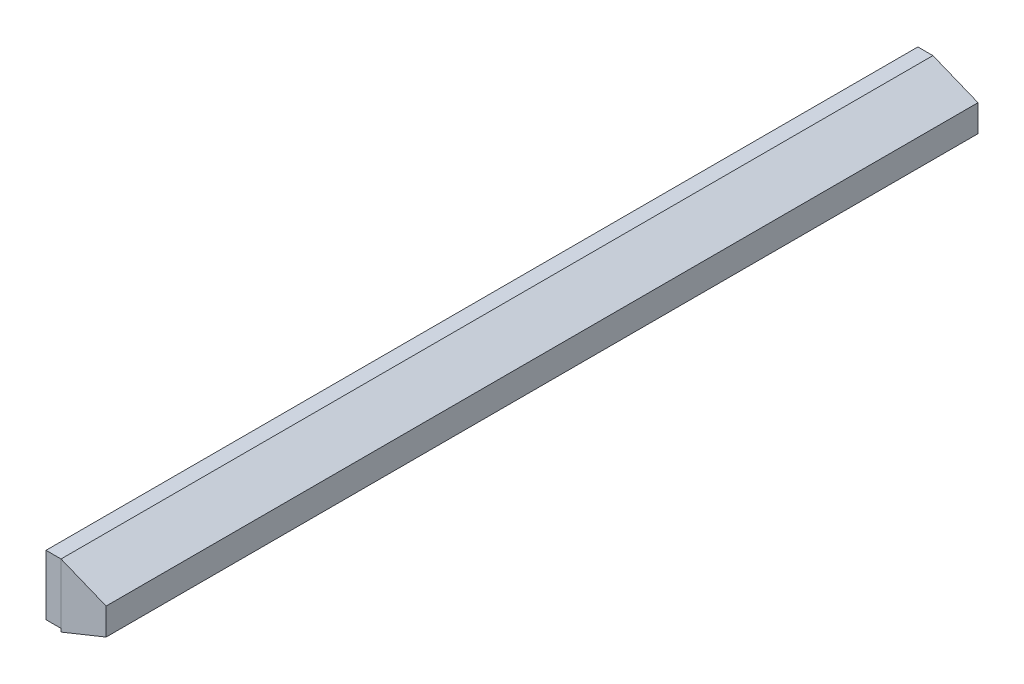
ISO-10303-21;
HEADER;
FILE_DESCRIPTION(('STEP AP214'),'2;1');
FILE_NAME('part.step','',(''),(''),'','','');
FILE_SCHEMA(('AUTOMOTIVE_DESIGN { 1 0 10303 214 1 1 1 1 }'));
ENDSEC;
DATA;
#1=APPLICATION_CONTEXT('core data for automotive mechanical design processes');
#2=APPLICATION_PROTOCOL_DEFINITION('international standard','automotive_design',2000,#1);
#3=PRODUCT_CONTEXT('',#1,'mechanical');
#4=PRODUCT('Part','Part','',(#3));
#5=PRODUCT_RELATED_PRODUCT_CATEGORY('part','',(#4));
#6=PRODUCT_DEFINITION_FORMATION('','',#4);
#7=PRODUCT_DEFINITION_CONTEXT('part definition',#1,'design');
#8=PRODUCT_DEFINITION('design','',#6,#7);
#9=PRODUCT_DEFINITION_SHAPE('','',#8);
#10=(LENGTH_UNIT() NAMED_UNIT(*) SI_UNIT(.MILLI.,.METRE.));
#11=(NAMED_UNIT(*) PLANE_ANGLE_UNIT() SI_UNIT($,.RADIAN.));
#12=(NAMED_UNIT(*) SI_UNIT($,.STERADIAN.) SOLID_ANGLE_UNIT());
#13=UNCERTAINTY_MEASURE_WITH_UNIT(LENGTH_MEASURE(1.E-05),#10,'distance_accuracy_value','');
#14=(GEOMETRIC_REPRESENTATION_CONTEXT(3) GLOBAL_UNCERTAINTY_ASSIGNED_CONTEXT((#13)) GLOBAL_UNIT_ASSIGNED_CONTEXT((#10,
#11,#12)) REPRESENTATION_CONTEXT('',''));
#15=CARTESIAN_POINT('',(0.,0.,0.));
#16=DIRECTION('',(0.,0.,1.));
#17=DIRECTION('',(1.,0.,0.));
#18=AXIS2_PLACEMENT_3D('',#15,#16,#17);
#19=CARTESIAN_POINT('',(2.50000000000001,-8.03019669376367,-145.));
#20=DIRECTION('',(1.,0.,0.));
#21=DIRECTION('',(0.,0.,-1.));
#22=AXIS2_PLACEMENT_3D('',#19,#20,#21);
#23=PLANE('',#22);
#24=DIRECTION('',(0.,1.,0.));
#25=VECTOR('',#24,1.);
#26=CARTESIAN_POINT('',(2.50000000000001,-8.03019669376367,145.));
#27=LINE('',#26,#25);
#28=CARTESIAN_POINT('',(2.50000000000001,-11.0603933875273,145.));
#29=VERTEX_POINT('',#28);
#30=CARTESIAN_POINT('',(2.50000000000001,10.,145.));
#31=VERTEX_POINT('',#30);
#32=EDGE_CURVE('E105',#29,#31,#27,.T.);
#33=ORIENTED_EDGE('',*,*,#32,.T.);
#34=DIRECTION('',(0.,0.,-1.));
#35=VECTOR('',#34,1.);
#36=CARTESIAN_POINT('',(2.50000000000001,10.,0.));
#37=LINE('',#36,#35);
#38=CARTESIAN_POINT('',(2.50000000000001,10.,-145.));
#39=VERTEX_POINT('',#38);
#40=EDGE_CURVE('E12',#39,#31,#37,.F.);
#41=ORIENTED_EDGE('',*,*,#40,.F.);
#42=DIRECTION('',(0.,1.,0.));
#43=VECTOR('',#42,1.);
#44=CARTESIAN_POINT('',(2.50000000000001,-8.03019669376367,-145.));
#45=LINE('',#44,#43);
#46=CARTESIAN_POINT('',(2.50000000000001,-11.0603933875273,-145.));
#47=VERTEX_POINT('',#46);
#48=EDGE_CURVE('E88',#47,#39,#45,.T.);
#49=ORIENTED_EDGE('',*,*,#48,.F.);
#50=DIRECTION('',(0.,0.,-1.));
#51=VECTOR('',#50,1.);
#52=CARTESIAN_POINT('',(2.50000000000001,-11.0603933875273,-145.));
#53=LINE('',#52,#51);
#54=EDGE_CURVE('E101',#47,#29,#53,.F.);
#55=ORIENTED_EDGE('',*,*,#54,.T.);
#56=EDGE_LOOP('',(#33,#41,#49,#55));
#57=FACE_BOUND('',#56,.T.);
#58=ADVANCED_FACE('F47',(#57),#23,.F.);
#59=CARTESIAN_POINT('',(10.,6.96980330623633,0.));
#60=DIRECTION('',(0.374606593415912,0.927183854566787,0.));
#61=DIRECTION('',(0.927183854566787,-0.374606593415912,0.));
#62=AXIS2_PLACEMENT_3D('',#59,#60,#61);
#63=PLANE('',#62);
#64=DIRECTION('',(-0.927183854566787,0.374606593415912,0.));
#65=VECTOR('',#64,1.);
#66=CARTESIAN_POINT('',(12.6049688892212,5.91732755750627,145.));
#67=LINE('',#66,#65);
#68=CARTESIAN_POINT('',(17.5,3.93960661247265,145.));
#69=VERTEX_POINT('',#68);
#70=EDGE_CURVE('E93',#31,#69,#67,.F.);
#71=ORIENTED_EDGE('',*,*,#70,.T.);
#72=DIRECTION('',(0.,0.,-1.));
#73=VECTOR('',#72,1.);
#74=CARTESIAN_POINT('',(17.5,3.93960661247265,-145.));
#75=LINE('',#74,#73);
#76=CARTESIAN_POINT('',(17.5,3.93960661247265,-145.));
#77=VERTEX_POINT('',#76);
#78=EDGE_CURVE('E51',#77,#69,#75,.F.);
#79=ORIENTED_EDGE('',*,*,#78,.F.);
#80=DIRECTION('',(-0.927183854566787,0.374606593415912,0.));
#81=VECTOR('',#80,1.);
#82=CARTESIAN_POINT('',(12.6049688892212,5.91732755750627,-145.));
#83=LINE('',#82,#81);
#84=EDGE_CURVE('E81',#39,#77,#83,.F.);
#85=ORIENTED_EDGE('',*,*,#84,.F.);
#86=ORIENTED_EDGE('',*,*,#40,.T.);
#87=EDGE_LOOP('',(#71,#79,#85,#86));
#88=FACE_BOUND('',#87,.T.);
#89=ADVANCED_FACE('F49',(#88),#63,.T.);
#90=CARTESIAN_POINT('',(17.5,-8.03019669376367,-145.));
#91=DIRECTION('',(-1.,0.,0.));
#92=DIRECTION('',(0.,0.,1.));
#93=AXIS2_PLACEMENT_3D('',#90,#91,#92);
#94=PLANE('',#93);
#95=DIRECTION('',(0.,-1.,0.));
#96=VECTOR('',#95,1.);
#97=CARTESIAN_POINT('',(17.5,-8.03019669376367,145.));
#98=LINE('',#97,#96);
#99=CARTESIAN_POINT('',(17.5,-4.99999999999999,145.));
#100=VERTEX_POINT('',#99);
#101=EDGE_CURVE('E108',#69,#100,#98,.T.);
#102=ORIENTED_EDGE('',*,*,#101,.T.);
#103=DIRECTION('',(0.,0.,-1.));
#104=VECTOR('',#103,1.);
#105=CARTESIAN_POINT('',(17.5,-4.99999999999999,0.));
#106=LINE('',#105,#104);
#107=CARTESIAN_POINT('',(17.5,-4.99999999999999,-145.));
#108=VERTEX_POINT('',#107);
#109=EDGE_CURVE('E97',#108,#100,#106,.F.);
#110=ORIENTED_EDGE('',*,*,#109,.F.);
#111=DIRECTION('',(0.,-1.,0.));
#112=VECTOR('',#111,1.);
#113=CARTESIAN_POINT('',(17.5,-8.03019669376367,-145.));
#114=LINE('',#113,#112);
#115=EDGE_CURVE('E85',#77,#108,#114,.T.);
#116=ORIENTED_EDGE('',*,*,#115,.F.);
#117=ORIENTED_EDGE('',*,*,#78,.T.);
#118=EDGE_LOOP('',(#102,#110,#116,#117));
#119=FACE_BOUND('',#118,.T.);
#120=ADVANCED_FACE('F98',(#119),#94,.F.);
#121=CARTESIAN_POINT('',(10.,-8.03019669376367,0.));
#122=DIRECTION('',(0.374606593415912,-0.927183854566787,0.));
#123=DIRECTION('',(-0.927183854566787,-0.374606593415912,0.));
#124=AXIS2_PLACEMENT_3D('',#121,#122,#123);
#125=PLANE('',#124);
#126=DIRECTION('',(0.927183854566787,0.374606593415912,0.));
#127=VECTOR('',#126,1.);
#128=CARTESIAN_POINT('',(12.6049688892212,-6.97772094503361,145.));
#129=LINE('',#128,#127);
#130=EDGE_CURVE('E110',#100,#29,#129,.F.);
#131=ORIENTED_EDGE('',*,*,#130,.T.);
#132=ORIENTED_EDGE('',*,*,#54,.F.);
#133=DIRECTION('',(0.927183854566787,0.374606593415912,0.));
#134=VECTOR('',#133,1.);
#135=CARTESIAN_POINT('',(12.6049688892212,-6.97772094503361,-145.));
#136=LINE('',#135,#134);
#137=EDGE_CURVE('E65',#108,#47,#136,.F.);
#138=ORIENTED_EDGE('',*,*,#137,.F.);
#139=ORIENTED_EDGE('',*,*,#109,.T.);
#140=EDGE_LOOP('',(#131,#132,#138,#139));
#141=FACE_BOUND('',#140,.T.);
#142=ADVANCED_FACE('F121',(#141),#125,.T.);
#143=CARTESIAN_POINT('',(10.,-0.530196693763668,-145.));
#144=DIRECTION('',(0.,0.,1.));
#145=DIRECTION('',(1.,0.,0.));
#146=AXIS2_PLACEMENT_3D('',#143,#144,#145);
#147=PLANE('',#146);
#148=ORIENTED_EDGE('',*,*,#48,.T.);
#149=ORIENTED_EDGE('',*,*,#84,.T.);
#150=ORIENTED_EDGE('',*,*,#115,.T.);
#151=ORIENTED_EDGE('',*,*,#137,.T.);
#152=EDGE_LOOP('',(#148,#149,#150,#151));
#153=FACE_BOUND('',#152,.T.);
#154=ADVANCED_FACE('F83',(#153),#147,.F.);
#155=CARTESIAN_POINT('',(10.,-0.530196693763668,145.));
#156=DIRECTION('',(0.,0.,1.));
#157=DIRECTION('',(1.,0.,0.));
#158=AXIS2_PLACEMENT_3D('',#155,#156,#157);
#159=PLANE('',#158);
#160=ORIENTED_EDGE('',*,*,#32,.F.);
#161=ORIENTED_EDGE('',*,*,#130,.F.);
#162=ORIENTED_EDGE('',*,*,#101,.F.);
#163=ORIENTED_EDGE('',*,*,#70,.F.);
#164=EDGE_LOOP('',(#160,#161,#162,#163));
#165=FACE_BOUND('',#164,.T.);
#166=ADVANCED_FACE('F120',(#165),#159,.T.);
#167=CLOSED_SHELL('',(#58,#89,#120,#142,#154,#166));
#168=MANIFOLD_SOLID_BREP('B2',#167);
#169=CARTESIAN_POINT('',(2.5,-10.,145.));
#170=DIRECTION('',(-1.,0.,0.));
#171=DIRECTION('',(0.,0.,1.));
#172=AXIS2_PLACEMENT_3D('',#169,#170,#171);
#173=PLANE('',#172);
#174=DIRECTION('',(0.,1.,0.));
#175=VECTOR('',#174,1.);
#176=CARTESIAN_POINT('',(2.5,-10.,-145.));
#177=LINE('',#176,#175);
#178=CARTESIAN_POINT('',(2.5,-10.,-145.));
#179=VERTEX_POINT('',#178);
#180=CARTESIAN_POINT('',(2.5,10.,-145.));
#181=VERTEX_POINT('',#180);
#182=EDGE_CURVE('E234',#179,#181,#177,.T.);
#183=ORIENTED_EDGE('',*,*,#182,.T.);
#184=DIRECTION('',(0.,0.,-1.));
#185=VECTOR('',#184,1.);
#186=CARTESIAN_POINT('',(2.5,10.,145.));
#187=LINE('',#186,#185);
#188=CARTESIAN_POINT('',(2.5,10.,145.));
#189=VERTEX_POINT('',#188);
#190=EDGE_CURVE('E45',#189,#181,#187,.T.);
#191=ORIENTED_EDGE('',*,*,#190,.F.);
#192=DIRECTION('',(0.,1.,0.));
#193=VECTOR('',#192,1.);
#194=CARTESIAN_POINT('',(2.5,-10.,145.));
#195=LINE('',#194,#193);
#196=CARTESIAN_POINT('',(2.5,-10.,145.));
#197=VERTEX_POINT('',#196);
#198=EDGE_CURVE('E222',#197,#189,#195,.T.);
#199=ORIENTED_EDGE('',*,*,#198,.F.);
#200=DIRECTION('',(0.,0.,-1.));
#201=VECTOR('',#200,1.);
#202=CARTESIAN_POINT('',(2.5,-10.,145.));
#203=LINE('',#202,#201);
#204=EDGE_CURVE('E230',#197,#179,#203,.T.);
#205=ORIENTED_EDGE('',*,*,#204,.T.);
#206=EDGE_LOOP('',(#183,#191,#199,#205));
#207=FACE_BOUND('',#206,.T.);
#208=ADVANCED_FACE('F171',(#207),#173,.F.);
#209=CARTESIAN_POINT('',(-2.5,10.,145.));
#210=DIRECTION('',(0.,-1.,0.));
#211=DIRECTION('',(0.,0.,-1.));
#212=AXIS2_PLACEMENT_3D('',#209,#210,#211);
#213=PLANE('',#212);
#214=DIRECTION('',(-1.,0.,0.));
#215=VECTOR('',#214,1.);
#216=CARTESIAN_POINT('',(-2.5,10.,-145.));
#217=LINE('',#216,#215);
#218=CARTESIAN_POINT('',(-2.5,10.,-145.));
#219=VERTEX_POINT('',#218);
#220=EDGE_CURVE('E226',#181,#219,#217,.T.);
#221=ORIENTED_EDGE('',*,*,#220,.T.);
#222=DIRECTION('',(0.,0.,-1.));
#223=VECTOR('',#222,1.);
#224=CARTESIAN_POINT('',(-2.5,10.,145.));
#225=LINE('',#224,#223);
#226=CARTESIAN_POINT('',(-2.5,10.,145.));
#227=VERTEX_POINT('',#226);
#228=EDGE_CURVE('E179',#227,#219,#225,.T.);
#229=ORIENTED_EDGE('',*,*,#228,.F.);
#230=DIRECTION('',(-1.,0.,0.));
#231=VECTOR('',#230,1.);
#232=CARTESIAN_POINT('',(-2.5,10.,145.));
#233=LINE('',#232,#231);
#234=EDGE_CURVE('E217',#189,#227,#233,.T.);
#235=ORIENTED_EDGE('',*,*,#234,.F.);
#236=ORIENTED_EDGE('',*,*,#190,.T.);
#237=EDGE_LOOP('',(#221,#229,#235,#236));
#238=FACE_BOUND('',#237,.T.);
#239=ADVANCED_FACE('F225',(#238),#213,.F.);
#240=CARTESIAN_POINT('',(-2.5,-10.,145.));
#241=DIRECTION('',(1.,0.,0.));
#242=DIRECTION('',(0.,0.,-1.));
#243=AXIS2_PLACEMENT_3D('',#240,#241,#242);
#244=PLANE('',#243);
#245=DIRECTION('',(0.,-1.,0.));
#246=VECTOR('',#245,1.);
#247=CARTESIAN_POINT('',(-2.5,-10.,-145.));
#248=LINE('',#247,#246);
#249=CARTESIAN_POINT('',(-2.5,-10.,-145.));
#250=VERTEX_POINT('',#249);
#251=EDGE_CURVE('E204',#219,#250,#248,.T.);
#252=ORIENTED_EDGE('',*,*,#251,.T.);
#253=DIRECTION('',(0.,0.,-1.));
#254=VECTOR('',#253,1.);
#255=CARTESIAN_POINT('',(-2.5,-10.,145.));
#256=LINE('',#255,#254);
#257=CARTESIAN_POINT('',(-2.5,-10.,145.));
#258=VERTEX_POINT('',#257);
#259=EDGE_CURVE('E227',#258,#250,#256,.T.);
#260=ORIENTED_EDGE('',*,*,#259,.F.);
#261=DIRECTION('',(0.,-1.,0.));
#262=VECTOR('',#261,1.);
#263=CARTESIAN_POINT('',(-2.5,-10.,145.));
#264=LINE('',#263,#262);
#265=EDGE_CURVE('E220',#227,#258,#264,.T.);
#266=ORIENTED_EDGE('',*,*,#265,.F.);
#267=ORIENTED_EDGE('',*,*,#228,.T.);
#268=EDGE_LOOP('',(#252,#260,#266,#267));
#269=FACE_BOUND('',#268,.T.);
#270=ADVANCED_FACE('F228',(#269),#244,.F.);
#271=CARTESIAN_POINT('',(-2.5,-10.,145.));
#272=DIRECTION('',(0.,1.,0.));
#273=DIRECTION('',(0.,0.,1.));
#274=AXIS2_PLACEMENT_3D('',#271,#272,#273);
#275=PLANE('',#274);
#276=DIRECTION('',(1.,0.,0.));
#277=VECTOR('',#276,1.);
#278=CARTESIAN_POINT('',(-2.5,-10.,-145.));
#279=LINE('',#278,#277);
#280=EDGE_CURVE('E210',#250,#179,#279,.T.);
#281=ORIENTED_EDGE('',*,*,#280,.T.);
#282=ORIENTED_EDGE('',*,*,#204,.F.);
#283=DIRECTION('',(1.,0.,0.));
#284=VECTOR('',#283,1.);
#285=CARTESIAN_POINT('',(-2.5,-10.,145.));
#286=LINE('',#285,#284);
#287=EDGE_CURVE('E187',#258,#197,#286,.T.);
#288=ORIENTED_EDGE('',*,*,#287,.F.);
#289=ORIENTED_EDGE('',*,*,#259,.T.);
#290=EDGE_LOOP('',(#281,#282,#288,#289));
#291=FACE_BOUND('',#290,.T.);
#292=ADVANCED_FACE('F241',(#291),#275,.F.);
#293=CARTESIAN_POINT('',(0.,0.,145.));
#294=DIRECTION('',(0.,0.,-1.));
#295=DIRECTION('',(-1.,0.,0.));
#296=AXIS2_PLACEMENT_3D('',#293,#294,#295);
#297=PLANE('',#296);
#298=ORIENTED_EDGE('',*,*,#198,.T.);
#299=ORIENTED_EDGE('',*,*,#234,.T.);
#300=ORIENTED_EDGE('',*,*,#265,.T.);
#301=ORIENTED_EDGE('',*,*,#287,.T.);
#302=EDGE_LOOP('',(#298,#299,#300,#301));
#303=FACE_BOUND('',#302,.T.);
#304=ADVANCED_FACE('F218',(#303),#297,.F.);
#305=CARTESIAN_POINT('',(0.,0.,-145.));
#306=DIRECTION('',(0.,0.,-1.));
#307=DIRECTION('',(-1.,0.,0.));
#308=AXIS2_PLACEMENT_3D('',#305,#306,#307);
#309=PLANE('',#308);
#310=ORIENTED_EDGE('',*,*,#182,.F.);
#311=ORIENTED_EDGE('',*,*,#280,.F.);
#312=ORIENTED_EDGE('',*,*,#251,.F.);
#313=ORIENTED_EDGE('',*,*,#220,.F.);
#314=EDGE_LOOP('',(#310,#311,#312,#313));
#315=FACE_BOUND('',#314,.T.);
#316=ADVANCED_FACE('F244',(#315),#309,.T.);
#317=CLOSED_SHELL('',(#208,#239,#270,#292,#304,#316));
#318=MANIFOLD_SOLID_BREP('B6',#317);
#319=ADVANCED_BREP_SHAPE_REPRESENTATION('',(#18,#168,#318),#14);
#320=SHAPE_DEFINITION_REPRESENTATION(#9,#319);
ENDSEC;
END-ISO-10303-21;
